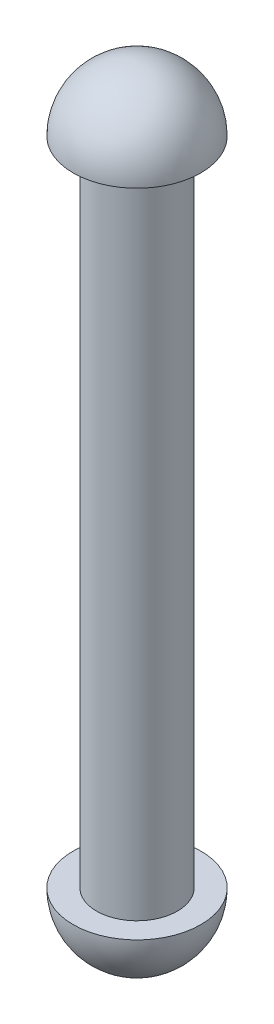
ISO-10303-21;
HEADER;
FILE_DESCRIPTION(('STEP AP214'),'2;1');
FILE_NAME('part.step','',(''),(''),'','','');
FILE_SCHEMA(('AUTOMOTIVE_DESIGN { 1 0 10303 214 1 1 1 1 }'));
ENDSEC;
DATA;
#1=APPLICATION_CONTEXT('core data for automotive mechanical design processes');
#2=APPLICATION_PROTOCOL_DEFINITION('international standard','automotive_design',2000,#1);
#3=PRODUCT_CONTEXT('',#1,'mechanical');
#4=PRODUCT('Part','Part','',(#3));
#5=PRODUCT_RELATED_PRODUCT_CATEGORY('part','',(#4));
#6=PRODUCT_DEFINITION_FORMATION('','',#4);
#7=PRODUCT_DEFINITION_CONTEXT('part definition',#1,'design');
#8=PRODUCT_DEFINITION('design','',#6,#7);
#9=PRODUCT_DEFINITION_SHAPE('','',#8);
#10=(LENGTH_UNIT() NAMED_UNIT(*) SI_UNIT(.MILLI.,.METRE.));
#11=(NAMED_UNIT(*) PLANE_ANGLE_UNIT() SI_UNIT($,.RADIAN.));
#12=(NAMED_UNIT(*) SI_UNIT($,.STERADIAN.) SOLID_ANGLE_UNIT());
#13=UNCERTAINTY_MEASURE_WITH_UNIT(LENGTH_MEASURE(1.E-05),#10,'distance_accuracy_value','');
#14=(GEOMETRIC_REPRESENTATION_CONTEXT(3) GLOBAL_UNCERTAINTY_ASSIGNED_CONTEXT((#13)) GLOBAL_UNIT_ASSIGNED_CONTEXT((#10,
#11,#12)) REPRESENTATION_CONTEXT('',''));
#15=CARTESIAN_POINT('',(0.,0.,0.));
#16=DIRECTION('',(0.,0.,1.));
#17=DIRECTION('',(1.,0.,0.));
#18=AXIS2_PLACEMENT_3D('',#15,#16,#17);
#19=CARTESIAN_POINT('',(0.,-306.,0.));
#20=DIRECTION('',(0.,-1.,0.));
#21=DIRECTION('',(0.,0.,-1.));
#22=AXIS2_PLACEMENT_3D('',#19,#20,#21);
#23=PLANE('',#22);
#24=CARTESIAN_POINT('',(0.,-306.,0.));
#25=DIRECTION('',(0.,1.,0.));
#26=DIRECTION('',(0.,0.,1.));
#27=AXIS2_PLACEMENT_3D('',#24,#25,#26);
#28=CIRCLE('',#27,19.);
#29=CARTESIAN_POINT('',(0.,-306.,19.));
#30=VERTEX_POINT('',#29);
#31=EDGE_CURVE('E43',#30,#30,#28,.T.);
#32=ORIENTED_EDGE('',*,*,#31,.F.);
#33=EDGE_LOOP('',(#32));
#34=FACE_BOUND('',#33,.T.);
#35=CARTESIAN_POINT('',(0.,-306.,0.));
#36=DIRECTION('',(0.,1.,0.));
#37=DIRECTION('',(0.,0.,1.));
#38=AXIS2_PLACEMENT_3D('',#35,#36,#37);
#39=CIRCLE('',#38,30.);
#40=CARTESIAN_POINT('',(0.,-306.,30.));
#41=VERTEX_POINT('',#40);
#42=EDGE_CURVE('E47',#41,#41,#39,.T.);
#43=ORIENTED_EDGE('',*,*,#42,.T.);
#44=EDGE_LOOP('',(#43));
#45=FACE_BOUND('',#44,.T.);
#46=ADVANCED_FACE('F32',(#34,#45),#23,.F.);
#47=CARTESIAN_POINT('',(0.,30.,0.));
#48=DIRECTION('',(0.,1.,0.));
#49=DIRECTION('',(0.,0.,1.));
#50=AXIS2_PLACEMENT_3D('',#47,#48,#49);
#51=CYLINDRICAL_SURFACE('',#50,19.);
#52=ORIENTED_EDGE('',*,*,#31,.T.);
#53=EDGE_LOOP('',(#52));
#54=FACE_BOUND('',#53,.T.);
#55=CARTESIAN_POINT('',(0.,0.,0.));
#56=DIRECTION('',(0.,1.,0.));
#57=DIRECTION('',(0.,0.,1.));
#58=AXIS2_PLACEMENT_3D('',#55,#56,#57);
#59=CIRCLE('',#58,19.);
#60=CARTESIAN_POINT('',(0.,0.,19.));
#61=VERTEX_POINT('',#60);
#62=EDGE_CURVE('E39',#61,#61,#59,.T.);
#63=ORIENTED_EDGE('',*,*,#62,.F.);
#64=EDGE_LOOP('',(#63));
#65=FACE_BOUND('',#64,.T.);
#66=ADVANCED_FACE('F56',(#54,#65),#51,.T.);
#67=CARTESIAN_POINT('',(0.,-306.,0.));
#68=DIRECTION('',(0.,1.,0.));
#69=DIRECTION('',(1.,0.,0.));
#70=AXIS2_PLACEMENT_3D('',#67,#68,#69);
#71=SPHERICAL_SURFACE('',#70,30.);
#72=ORIENTED_EDGE('',*,*,#42,.F.);
#73=EDGE_LOOP('',(#72));
#74=FACE_BOUND('',#73,.T.);
#75=ADVANCED_FACE('F34',(#74),#71,.T.);
#76=CARTESIAN_POINT('',(0.,0.,0.));
#77=DIRECTION('',(0.,-1.,0.));
#78=DIRECTION('',(0.,0.,-1.));
#79=AXIS2_PLACEMENT_3D('',#76,#77,#78);
#80=PLANE('',#79);
#81=ORIENTED_EDGE('',*,*,#62,.T.);
#82=EDGE_LOOP('',(#81));
#83=FACE_BOUND('',#82,.T.);
#84=CARTESIAN_POINT('',(0.,0.,0.));
#85=DIRECTION('',(0.,1.,0.));
#86=DIRECTION('',(0.,0.,1.));
#87=AXIS2_PLACEMENT_3D('',#84,#85,#86);
#88=CIRCLE('',#87,30.);
#89=CARTESIAN_POINT('',(0.,0.,30.));
#90=VERTEX_POINT('',#89);
#91=EDGE_CURVE('E10',#90,#90,#88,.T.);
#92=ORIENTED_EDGE('',*,*,#91,.F.);
#93=EDGE_LOOP('',(#92));
#94=FACE_BOUND('',#93,.T.);
#95=ADVANCED_FACE('F55',(#83,#94),#80,.T.);
#96=CARTESIAN_POINT('',(0.,0.,0.));
#97=DIRECTION('',(0.,1.,0.));
#98=DIRECTION('',(1.,0.,0.));
#99=AXIS2_PLACEMENT_3D('',#96,#97,#98);
#100=SPHERICAL_SURFACE('',#99,30.);
#101=ORIENTED_EDGE('',*,*,#91,.T.);
#102=EDGE_LOOP('',(#101));
#103=FACE_BOUND('',#102,.T.);
#104=ADVANCED_FACE('F61',(#103),#100,.T.);
#105=CLOSED_SHELL('',(#46,#66,#75,#95,#104));
#106=MANIFOLD_SOLID_BREP('B2',#105);
#107=ADVANCED_BREP_SHAPE_REPRESENTATION('',(#18,#106),#14);
#108=SHAPE_DEFINITION_REPRESENTATION(#9,#107);
ENDSEC;
END-ISO-10303-21;
